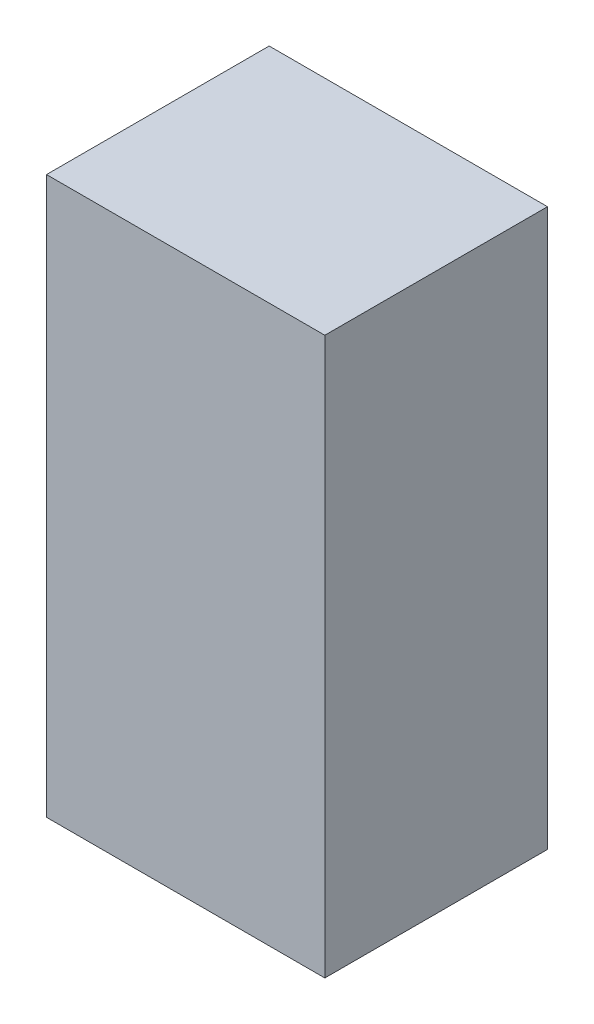
ISO-10303-21;
HEADER;
FILE_DESCRIPTION(('STEP AP214'),'2;1');
FILE_NAME('part.step','',(''),(''),'','','');
FILE_SCHEMA(('AUTOMOTIVE_DESIGN { 1 0 10303 214 1 1 1 1 }'));
ENDSEC;
DATA;
#1=APPLICATION_CONTEXT('core data for automotive mechanical design processes');
#2=APPLICATION_PROTOCOL_DEFINITION('international standard','automotive_design',2000,#1);
#3=PRODUCT_CONTEXT('',#1,'mechanical');
#4=PRODUCT('Part','Part','',(#3));
#5=PRODUCT_RELATED_PRODUCT_CATEGORY('part','',(#4));
#6=PRODUCT_DEFINITION_FORMATION('','',#4);
#7=PRODUCT_DEFINITION_CONTEXT('part definition',#1,'design');
#8=PRODUCT_DEFINITION('design','',#6,#7);
#9=PRODUCT_DEFINITION_SHAPE('','',#8);
#10=(LENGTH_UNIT() NAMED_UNIT(*) SI_UNIT(.MILLI.,.METRE.));
#11=(NAMED_UNIT(*) PLANE_ANGLE_UNIT() SI_UNIT($,.RADIAN.));
#12=(NAMED_UNIT(*) SI_UNIT($,.STERADIAN.) SOLID_ANGLE_UNIT());
#13=UNCERTAINTY_MEASURE_WITH_UNIT(LENGTH_MEASURE(1.E-05),#10,'distance_accuracy_value','');
#14=(GEOMETRIC_REPRESENTATION_CONTEXT(3) GLOBAL_UNCERTAINTY_ASSIGNED_CONTEXT((#13)) GLOBAL_UNIT_ASSIGNED_CONTEXT((#10,
#11,#12)) REPRESENTATION_CONTEXT('',''));
#15=CARTESIAN_POINT('',(0.,0.,0.));
#16=DIRECTION('',(0.,0.,1.));
#17=DIRECTION('',(1.,0.,0.));
#18=AXIS2_PLACEMENT_3D('',#15,#16,#17);
#19=CARTESIAN_POINT('',(12.5,-12.5,-5.));
#20=DIRECTION('',(0.,0.,1.));
#21=DIRECTION('',(1.,0.,0.));
#22=AXIS2_PLACEMENT_3D('',#19,#20,#21);
#23=PLANE('',#22);
#24=DIRECTION('',(0.,1.,0.));
#25=VECTOR('',#24,1.);
#26=CARTESIAN_POINT('',(0.,-12.5,-5.));
#27=LINE('',#26,#25);
#28=CARTESIAN_POINT('',(0.,-12.5,-5.));
#29=VERTEX_POINT('',#28);
#30=CARTESIAN_POINT('',(0.,12.5,-5.));
#31=VERTEX_POINT('',#30);
#32=EDGE_CURVE('E105',#29,#31,#27,.T.);
#33=ORIENTED_EDGE('',*,*,#32,.T.);
#34=DIRECTION('',(-1.,0.,0.));
#35=VECTOR('',#34,1.);
#36=CARTESIAN_POINT('',(12.5,12.5,-5.));
#37=LINE('',#36,#35);
#38=CARTESIAN_POINT('',(12.5,12.5,-5.));
#39=VERTEX_POINT('',#38);
#40=EDGE_CURVE('E11',#39,#31,#37,.T.);
#41=ORIENTED_EDGE('',*,*,#40,.F.);
#42=DIRECTION('',(0.,1.,0.));
#43=VECTOR('',#42,1.);
#44=CARTESIAN_POINT('',(12.5,-12.5,-5.));
#45=LINE('',#44,#43);
#46=CARTESIAN_POINT('',(12.5,-12.5,-5.));
#47=VERTEX_POINT('',#46);
#48=EDGE_CURVE('E89',#47,#39,#45,.T.);
#49=ORIENTED_EDGE('',*,*,#48,.F.);
#50=DIRECTION('',(-1.,0.,0.));
#51=VECTOR('',#50,1.);
#52=CARTESIAN_POINT('',(12.5,-12.5,-5.));
#53=LINE('',#52,#51);
#54=EDGE_CURVE('E98',#47,#29,#53,.T.);
#55=ORIENTED_EDGE('',*,*,#54,.T.);
#56=EDGE_LOOP('',(#33,#41,#49,#55));
#57=FACE_BOUND('',#56,.T.);
#58=ADVANCED_FACE('F39',(#57),#23,.F.);
#59=CARTESIAN_POINT('',(12.5,12.5,5.));
#60=DIRECTION('',(0.,-1.,0.));
#61=DIRECTION('',(0.,0.,-1.));
#62=AXIS2_PLACEMENT_3D('',#59,#60,#61);
#63=PLANE('',#62);
#64=DIRECTION('',(0.,0.,1.));
#65=VECTOR('',#64,1.);
#66=CARTESIAN_POINT('',(0.,12.5,5.));
#67=LINE('',#66,#65);
#68=CARTESIAN_POINT('',(0.,12.5,5.));
#69=VERTEX_POINT('',#68);
#70=EDGE_CURVE('E94',#31,#69,#67,.T.);
#71=ORIENTED_EDGE('',*,*,#70,.T.);
#72=DIRECTION('',(-1.,0.,0.));
#73=VECTOR('',#72,1.);
#74=CARTESIAN_POINT('',(12.5,12.5,5.));
#75=LINE('',#74,#73);
#76=CARTESIAN_POINT('',(12.5,12.5,5.));
#77=VERTEX_POINT('',#76);
#78=EDGE_CURVE('E50',#77,#69,#75,.T.);
#79=ORIENTED_EDGE('',*,*,#78,.F.);
#80=DIRECTION('',(0.,0.,1.));
#81=VECTOR('',#80,1.);
#82=CARTESIAN_POINT('',(12.5,12.5,5.));
#83=LINE('',#82,#81);
#84=EDGE_CURVE('E84',#39,#77,#83,.T.);
#85=ORIENTED_EDGE('',*,*,#84,.F.);
#86=ORIENTED_EDGE('',*,*,#40,.T.);
#87=EDGE_LOOP('',(#71,#79,#85,#86));
#88=FACE_BOUND('',#87,.T.);
#89=ADVANCED_FACE('F91',(#88),#63,.F.);
#90=CARTESIAN_POINT('',(12.5,-12.5,5.));
#91=DIRECTION('',(0.,0.,-1.));
#92=DIRECTION('',(-1.,0.,0.));
#93=AXIS2_PLACEMENT_3D('',#90,#91,#92);
#94=PLANE('',#93);
#95=DIRECTION('',(0.,-1.,0.));
#96=VECTOR('',#95,1.);
#97=CARTESIAN_POINT('',(0.,-12.5,5.));
#98=LINE('',#97,#96);
#99=CARTESIAN_POINT('',(0.,-12.5,5.));
#100=VERTEX_POINT('',#99);
#101=EDGE_CURVE('E75',#69,#100,#98,.T.);
#102=ORIENTED_EDGE('',*,*,#101,.T.);
#103=DIRECTION('',(-1.,0.,0.));
#104=VECTOR('',#103,1.);
#105=CARTESIAN_POINT('',(12.5,-12.5,5.));
#106=LINE('',#105,#104);
#107=CARTESIAN_POINT('',(12.5,-12.5,5.));
#108=VERTEX_POINT('',#107);
#109=EDGE_CURVE('E92',#108,#100,#106,.T.);
#110=ORIENTED_EDGE('',*,*,#109,.F.);
#111=DIRECTION('',(0.,-1.,0.));
#112=VECTOR('',#111,1.);
#113=CARTESIAN_POINT('',(12.5,-12.5,5.));
#114=LINE('',#113,#112);
#115=EDGE_CURVE('E86',#77,#108,#114,.T.);
#116=ORIENTED_EDGE('',*,*,#115,.F.);
#117=ORIENTED_EDGE('',*,*,#78,.T.);
#118=EDGE_LOOP('',(#102,#110,#116,#117));
#119=FACE_BOUND('',#118,.T.);
#120=ADVANCED_FACE('F96',(#119),#94,.F.);
#121=CARTESIAN_POINT('',(12.5,-12.5,5.));
#122=DIRECTION('',(0.,1.,0.));
#123=DIRECTION('',(0.,0.,1.));
#124=AXIS2_PLACEMENT_3D('',#121,#122,#123);
#125=PLANE('',#124);
#126=DIRECTION('',(0.,0.,-1.));
#127=VECTOR('',#126,1.);
#128=CARTESIAN_POINT('',(0.,-12.5,5.));
#129=LINE('',#128,#127);
#130=EDGE_CURVE('E79',#100,#29,#129,.T.);
#131=ORIENTED_EDGE('',*,*,#130,.T.);
#132=ORIENTED_EDGE('',*,*,#54,.F.);
#133=DIRECTION('',(0.,0.,-1.));
#134=VECTOR('',#133,1.);
#135=CARTESIAN_POINT('',(12.5,-12.5,5.));
#136=LINE('',#135,#134);
#137=EDGE_CURVE('E54',#108,#47,#136,.T.);
#138=ORIENTED_EDGE('',*,*,#137,.F.);
#139=ORIENTED_EDGE('',*,*,#109,.T.);
#140=EDGE_LOOP('',(#131,#132,#138,#139));
#141=FACE_BOUND('',#140,.T.);
#142=ADVANCED_FACE('F108',(#141),#125,.F.);
#143=CARTESIAN_POINT('',(12.5,0.,0.));
#144=DIRECTION('',(-1.,0.,0.));
#145=DIRECTION('',(0.,0.,1.));
#146=AXIS2_PLACEMENT_3D('',#143,#144,#145);
#147=PLANE('',#146);
#148=ORIENTED_EDGE('',*,*,#48,.T.);
#149=ORIENTED_EDGE('',*,*,#84,.T.);
#150=ORIENTED_EDGE('',*,*,#115,.T.);
#151=ORIENTED_EDGE('',*,*,#137,.T.);
#152=EDGE_LOOP('',(#148,#149,#150,#151));
#153=FACE_BOUND('',#152,.T.);
#154=ADVANCED_FACE('F88',(#153),#147,.F.);
#155=CARTESIAN_POINT('',(0.,0.,0.));
#156=DIRECTION('',(-1.,0.,0.));
#157=DIRECTION('',(0.,0.,1.));
#158=AXIS2_PLACEMENT_3D('',#155,#156,#157);
#159=PLANE('',#158);
#160=ORIENTED_EDGE('',*,*,#32,.F.);
#161=ORIENTED_EDGE('',*,*,#130,.F.);
#162=ORIENTED_EDGE('',*,*,#101,.F.);
#163=ORIENTED_EDGE('',*,*,#70,.F.);
#164=EDGE_LOOP('',(#160,#161,#162,#163));
#165=FACE_BOUND('',#164,.T.);
#166=ADVANCED_FACE('F115',(#165),#159,.T.);
#167=CLOSED_SHELL('',(#58,#89,#120,#142,#154,#166));
#168=MANIFOLD_SOLID_BREP('B2',#167);
#169=ADVANCED_BREP_SHAPE_REPRESENTATION('',(#18,#168),#14);
#170=SHAPE_DEFINITION_REPRESENTATION(#9,#169);
ENDSEC;
END-ISO-10303-21;
